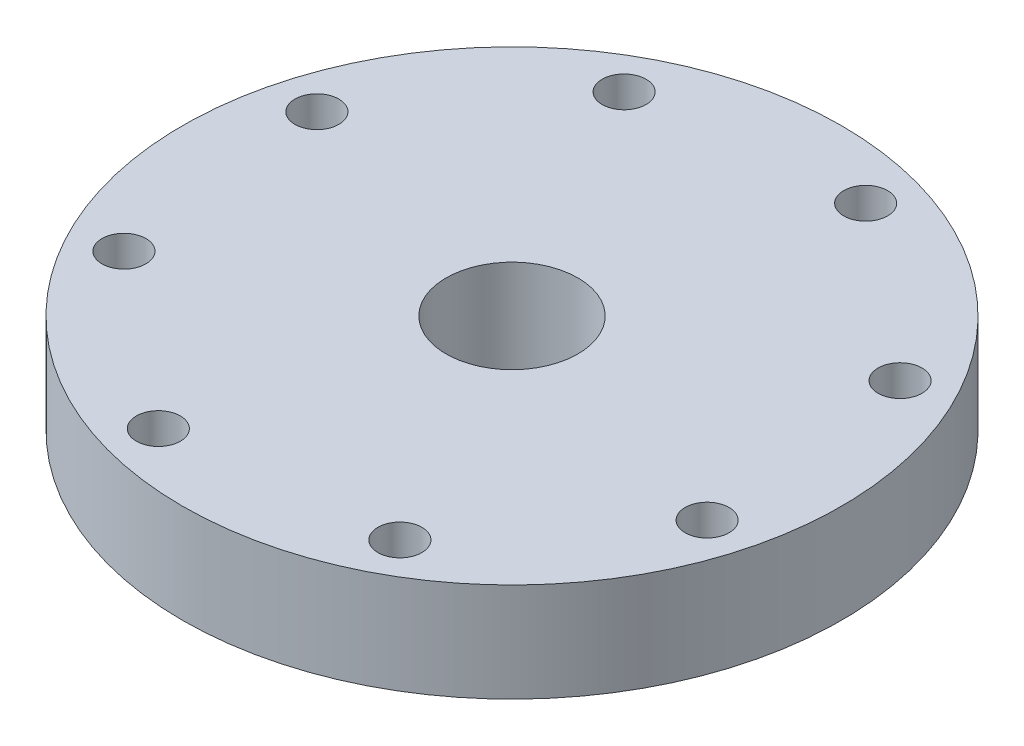
ISO-10303-21;
HEADER;
FILE_DESCRIPTION(('STEP AP214'),'2;1');
FILE_NAME('part.step','',(''),(''),'','','');
FILE_SCHEMA(('AUTOMOTIVE_DESIGN { 1 0 10303 214 1 1 1 1 }'));
ENDSEC;
DATA;
#1=APPLICATION_CONTEXT('core data for automotive mechanical design processes');
#2=APPLICATION_PROTOCOL_DEFINITION('international standard','automotive_design',2000,#1);
#3=PRODUCT_CONTEXT('',#1,'mechanical');
#4=PRODUCT('Part','Part','',(#3));
#5=PRODUCT_RELATED_PRODUCT_CATEGORY('part','',(#4));
#6=PRODUCT_DEFINITION_FORMATION('','',#4);
#7=PRODUCT_DEFINITION_CONTEXT('part definition',#1,'design');
#8=PRODUCT_DEFINITION('design','',#6,#7);
#9=PRODUCT_DEFINITION_SHAPE('','',#8);
#10=(LENGTH_UNIT() NAMED_UNIT(*) SI_UNIT(.MILLI.,.METRE.));
#11=(NAMED_UNIT(*) PLANE_ANGLE_UNIT() SI_UNIT($,.RADIAN.));
#12=(NAMED_UNIT(*) SI_UNIT($,.STERADIAN.) SOLID_ANGLE_UNIT());
#13=UNCERTAINTY_MEASURE_WITH_UNIT(LENGTH_MEASURE(1.E-05),#10,'distance_accuracy_value','');
#14=(GEOMETRIC_REPRESENTATION_CONTEXT(3) GLOBAL_UNCERTAINTY_ASSIGNED_CONTEXT((#13)) GLOBAL_UNIT_ASSIGNED_CONTEXT((#10,
#11,#12)) REPRESENTATION_CONTEXT('',''));
#15=CARTESIAN_POINT('',(0.,0.,0.));
#16=DIRECTION('',(0.,0.,1.));
#17=DIRECTION('',(1.,0.,0.));
#18=AXIS2_PLACEMENT_3D('',#15,#16,#17);
#19=CARTESIAN_POINT('',(0.,2.25,0.));
#20=DIRECTION('',(0.,-1.,0.));
#21=DIRECTION('',(0.,0.,-1.));
#22=AXIS2_PLACEMENT_3D('',#19,#20,#21);
#23=CYLINDRICAL_SURFACE('',#22,15.);
#24=CARTESIAN_POINT('',(0.,2.25,0.));
#25=DIRECTION('',(0.,1.,0.));
#26=DIRECTION('',(0.,0.,1.));
#27=AXIS2_PLACEMENT_3D('',#24,#25,#26);
#28=CIRCLE('',#27,15.);
#29=CARTESIAN_POINT('',(0.,2.25,15.));
#30=VERTEX_POINT('',#29);
#31=EDGE_CURVE('E10',#30,#30,#28,.T.);
#32=ORIENTED_EDGE('',*,*,#31,.F.);
#33=EDGE_LOOP('',(#32));
#34=FACE_BOUND('',#33,.T.);
#35=CARTESIAN_POINT('',(0.,-2.25,0.));
#36=DIRECTION('',(0.,1.,0.));
#37=DIRECTION('',(0.,0.,1.));
#38=AXIS2_PLACEMENT_3D('',#35,#36,#37);
#39=CIRCLE('',#38,15.);
#40=CARTESIAN_POINT('',(0.,-2.25,15.));
#41=VERTEX_POINT('',#40);
#42=EDGE_CURVE('E45',#41,#41,#39,.T.);
#43=ORIENTED_EDGE('',*,*,#42,.T.);
#44=EDGE_LOOP('',(#43));
#45=FACE_BOUND('',#44,.T.);
#46=ADVANCED_FACE('F37',(#34,#45),#23,.T.);
#47=CARTESIAN_POINT('',(0.,2.25,0.));
#48=DIRECTION('',(0.,1.,0.));
#49=DIRECTION('',(0.,0.,1.));
#50=AXIS2_PLACEMENT_3D('',#47,#48,#49);
#51=PLANE('',#50);
#52=CARTESIAN_POINT('',(0.,2.25,0.));
#53=DIRECTION('',(0.,-1.,0.));
#54=DIRECTION('',(0.,0.,-1.));
#55=AXIS2_PLACEMENT_3D('',#52,#53,#54);
#56=CIRCLE('',#55,3.);
#57=CARTESIAN_POINT('',(0.,2.25,-3.));
#58=VERTEX_POINT('',#57);
#59=EDGE_CURVE('E131',#58,#58,#56,.T.);
#60=ORIENTED_EDGE('',*,*,#59,.T.);
#61=EDGE_LOOP('',(#60));
#62=FACE_BOUND('',#61,.T.);
#63=CARTESIAN_POINT('',(-3.60811723817874,2.25,12.4892549816055));
#64=DIRECTION('',(0.,1.,0.));
#65=DIRECTION('',(0.,0.,1.));
#66=AXIS2_PLACEMENT_3D('',#63,#64,#65);
#67=CIRCLE('',#66,1.);
#68=CARTESIAN_POINT('',(-3.60811723817874,2.25,13.4892549816055));
#69=VERTEX_POINT('',#68);
#70=EDGE_CURVE('E135',#69,#69,#67,.T.);
#71=ORIENTED_EDGE('',*,*,#70,.F.);
#72=EDGE_LOOP('',(#71));
#73=FACE_BOUND('',#72,.T.);
#74=CARTESIAN_POINT('',(6.27991272302886,2.25,11.3825610558934));
#75=DIRECTION('',(0.,1.,0.));
#76=DIRECTION('',(0.,0.,1.));
#77=AXIS2_PLACEMENT_3D('',#74,#75,#76);
#78=CIRCLE('',#77,1.);
#79=CARTESIAN_POINT('',(6.27991272302886,2.25,12.3825610558934));
#80=VERTEX_POINT('',#79);
#81=EDGE_CURVE('E158',#80,#80,#78,.T.);
#82=ORIENTED_EDGE('',*,*,#81,.F.);
#83=EDGE_LOOP('',(#82));
#84=FACE_BOUND('',#83,.T.);
#85=CARTESIAN_POINT('',(12.4892549816055,2.25,3.6081172381787));
#86=DIRECTION('',(0.,1.,0.));
#87=DIRECTION('',(0.,0.,1.));
#88=AXIS2_PLACEMENT_3D('',#85,#86,#87);
#89=CIRCLE('',#88,1.);
#90=CARTESIAN_POINT('',(12.4892549816055,2.25,4.6081172381787));
#91=VERTEX_POINT('',#90);
#92=EDGE_CURVE('E154',#91,#91,#89,.T.);
#93=ORIENTED_EDGE('',*,*,#92,.F.);
#94=EDGE_LOOP('',(#93));
#95=FACE_BOUND('',#94,.T.);
#96=CARTESIAN_POINT('',(11.3825610558933,2.25,-6.2799127230289));
#97=DIRECTION('',(0.,1.,0.));
#98=DIRECTION('',(0.,0.,1.));
#99=AXIS2_PLACEMENT_3D('',#96,#97,#98);
#100=CIRCLE('',#99,1.);
#101=CARTESIAN_POINT('',(11.3825610558933,2.25,-5.2799127230289));
#102=VERTEX_POINT('',#101);
#103=EDGE_CURVE('E150',#102,#102,#100,.T.);
#104=ORIENTED_EDGE('',*,*,#103,.F.);
#105=EDGE_LOOP('',(#104));
#106=FACE_BOUND('',#105,.T.);
#107=CARTESIAN_POINT('',(3.60811723817866,2.25,-12.4892549816055));
#108=DIRECTION('',(0.,1.,0.));
#109=DIRECTION('',(0.,0.,1.));
#110=AXIS2_PLACEMENT_3D('',#107,#108,#109);
#111=CIRCLE('',#110,1.);
#112=CARTESIAN_POINT('',(3.60811723817866,2.25,-11.4892549816055));
#113=VERTEX_POINT('',#112);
#114=EDGE_CURVE('E146',#113,#113,#111,.T.);
#115=ORIENTED_EDGE('',*,*,#114,.F.);
#116=EDGE_LOOP('',(#115));
#117=FACE_BOUND('',#116,.T.);
#118=CARTESIAN_POINT('',(-6.27991272302894,2.25,-11.3825610558933));
#119=DIRECTION('',(0.,1.,0.));
#120=DIRECTION('',(0.,0.,1.));
#121=AXIS2_PLACEMENT_3D('',#118,#119,#120);
#122=CIRCLE('',#121,1.);
#123=CARTESIAN_POINT('',(-6.27991272302894,2.25,-10.3825610558933));
#124=VERTEX_POINT('',#123);
#125=EDGE_CURVE('E142',#124,#124,#122,.T.);
#126=ORIENTED_EDGE('',*,*,#125,.F.);
#127=EDGE_LOOP('',(#126));
#128=FACE_BOUND('',#127,.T.);
#129=CARTESIAN_POINT('',(-12.4892549816055,2.25,-3.60811723817861));
#130=DIRECTION('',(0.,1.,0.));
#131=DIRECTION('',(0.,0.,1.));
#132=AXIS2_PLACEMENT_3D('',#129,#130,#131);
#133=CIRCLE('',#132,0.999999999999999);
#134=CARTESIAN_POINT('',(-12.4892549816055,2.25,-2.60811723817861));
#135=VERTEX_POINT('',#134);
#136=EDGE_CURVE('E138',#135,#135,#133,.T.);
#137=ORIENTED_EDGE('',*,*,#136,.F.);
#138=EDGE_LOOP('',(#137));
#139=FACE_BOUND('',#138,.T.);
#140=CARTESIAN_POINT('',(-11.3825610558933,2.25,6.27991272302898));
#141=DIRECTION('',(0.,1.,0.));
#142=DIRECTION('',(0.,0.,1.));
#143=AXIS2_PLACEMENT_3D('',#140,#141,#142);
#144=CIRCLE('',#143,1.);
#145=CARTESIAN_POINT('',(-11.3825610558933,2.25,7.27991272302898));
#146=VERTEX_POINT('',#145);
#147=EDGE_CURVE('E53',#146,#146,#144,.T.);
#148=ORIENTED_EDGE('',*,*,#147,.F.);
#149=EDGE_LOOP('',(#148));
#150=FACE_BOUND('',#149,.T.);
#151=ORIENTED_EDGE('',*,*,#31,.T.);
#152=EDGE_LOOP('',(#151));
#153=FACE_BOUND('',#152,.T.);
#154=ADVANCED_FACE('F108',(#62,#73,#84,#95,#106,#117,#128,#139,#150,#153),#51,.T.);
#155=CARTESIAN_POINT('',(0.,-2.25,0.));
#156=DIRECTION('',(0.,1.,0.));
#157=DIRECTION('',(0.,0.,1.));
#158=AXIS2_PLACEMENT_3D('',#155,#156,#157);
#159=PLANE('',#158);
#160=CARTESIAN_POINT('',(0.,-2.25,0.));
#161=DIRECTION('',(0.,-1.,0.));
#162=DIRECTION('',(0.,0.,-1.));
#163=AXIS2_PLACEMENT_3D('',#160,#161,#162);
#164=CIRCLE('',#163,3.);
#165=CARTESIAN_POINT('',(0.,-2.25,-3.));
#166=VERTEX_POINT('',#165);
#167=EDGE_CURVE('E128',#166,#166,#164,.T.);
#168=ORIENTED_EDGE('',*,*,#167,.F.);
#169=EDGE_LOOP('',(#168));
#170=FACE_BOUND('',#169,.T.);
#171=CARTESIAN_POINT('',(-3.60811723817874,-2.25,12.4892549816055));
#172=DIRECTION('',(0.,1.,0.));
#173=DIRECTION('',(0.,0.,1.));
#174=AXIS2_PLACEMENT_3D('',#171,#172,#173);
#175=CIRCLE('',#174,1.);
#176=CARTESIAN_POINT('',(-3.60811723817874,-2.25,13.4892549816055));
#177=VERTEX_POINT('',#176);
#178=EDGE_CURVE('E40',#177,#177,#175,.T.);
#179=ORIENTED_EDGE('',*,*,#178,.T.);
#180=EDGE_LOOP('',(#179));
#181=FACE_BOUND('',#180,.T.);
#182=CARTESIAN_POINT('',(6.27991272302886,-2.25,11.3825610558934));
#183=DIRECTION('',(0.,1.,0.));
#184=DIRECTION('',(0.,0.,1.));
#185=AXIS2_PLACEMENT_3D('',#182,#183,#184);
#186=CIRCLE('',#185,1.);
#187=CARTESIAN_POINT('',(6.27991272302886,-2.25,12.3825610558934));
#188=VERTEX_POINT('',#187);
#189=EDGE_CURVE('E79',#188,#188,#186,.T.);
#190=ORIENTED_EDGE('',*,*,#189,.T.);
#191=EDGE_LOOP('',(#190));
#192=FACE_BOUND('',#191,.T.);
#193=CARTESIAN_POINT('',(12.4892549816055,-2.25,3.6081172381787));
#194=DIRECTION('',(0.,1.,0.));
#195=DIRECTION('',(0.,0.,1.));
#196=AXIS2_PLACEMENT_3D('',#193,#194,#195);
#197=CIRCLE('',#196,1.);
#198=CARTESIAN_POINT('',(12.4892549816055,-2.25,4.6081172381787));
#199=VERTEX_POINT('',#198);
#200=EDGE_CURVE('E76',#199,#199,#197,.T.);
#201=ORIENTED_EDGE('',*,*,#200,.T.);
#202=EDGE_LOOP('',(#201));
#203=FACE_BOUND('',#202,.T.);
#204=CARTESIAN_POINT('',(11.3825610558933,-2.25,-6.2799127230289));
#205=DIRECTION('',(0.,1.,0.));
#206=DIRECTION('',(0.,0.,1.));
#207=AXIS2_PLACEMENT_3D('',#204,#205,#206);
#208=CIRCLE('',#207,1.);
#209=CARTESIAN_POINT('',(11.3825610558933,-2.25,-5.2799127230289));
#210=VERTEX_POINT('',#209);
#211=EDGE_CURVE('E72',#210,#210,#208,.T.);
#212=ORIENTED_EDGE('',*,*,#211,.T.);
#213=EDGE_LOOP('',(#212));
#214=FACE_BOUND('',#213,.T.);
#215=CARTESIAN_POINT('',(3.60811723817866,-2.25,-12.4892549816055));
#216=DIRECTION('',(0.,1.,0.));
#217=DIRECTION('',(0.,0.,1.));
#218=AXIS2_PLACEMENT_3D('',#215,#216,#217);
#219=CIRCLE('',#218,1.);
#220=CARTESIAN_POINT('',(3.60811723817866,-2.25,-11.4892549816055));
#221=VERTEX_POINT('',#220);
#222=EDGE_CURVE('E68',#221,#221,#219,.T.);
#223=ORIENTED_EDGE('',*,*,#222,.T.);
#224=EDGE_LOOP('',(#223));
#225=FACE_BOUND('',#224,.T.);
#226=CARTESIAN_POINT('',(-6.27991272302894,-2.25,-11.3825610558933));
#227=DIRECTION('',(0.,1.,0.));
#228=DIRECTION('',(0.,0.,1.));
#229=AXIS2_PLACEMENT_3D('',#226,#227,#228);
#230=CIRCLE('',#229,1.);
#231=CARTESIAN_POINT('',(-6.27991272302894,-2.25,-10.3825610558933));
#232=VERTEX_POINT('',#231);
#233=EDGE_CURVE('E64',#232,#232,#230,.T.);
#234=ORIENTED_EDGE('',*,*,#233,.T.);
#235=EDGE_LOOP('',(#234));
#236=FACE_BOUND('',#235,.T.);
#237=CARTESIAN_POINT('',(-12.4892549816055,-2.25,-3.60811723817861));
#238=DIRECTION('',(0.,1.,0.));
#239=DIRECTION('',(0.,0.,1.));
#240=AXIS2_PLACEMENT_3D('',#237,#238,#239);
#241=CIRCLE('',#240,0.999999999999999);
#242=CARTESIAN_POINT('',(-12.4892549816055,-2.25,-2.60811723817861));
#243=VERTEX_POINT('',#242);
#244=EDGE_CURVE('E60',#243,#243,#241,.T.);
#245=ORIENTED_EDGE('',*,*,#244,.T.);
#246=EDGE_LOOP('',(#245));
#247=FACE_BOUND('',#246,.T.);
#248=CARTESIAN_POINT('',(-11.3825610558933,-2.25,6.27991272302898));
#249=DIRECTION('',(0.,1.,0.));
#250=DIRECTION('',(0.,0.,1.));
#251=AXIS2_PLACEMENT_3D('',#248,#249,#250);
#252=CIRCLE('',#251,1.);
#253=CARTESIAN_POINT('',(-11.3825610558933,-2.25,7.27991272302898));
#254=VERTEX_POINT('',#253);
#255=EDGE_CURVE('E56',#254,#254,#252,.T.);
#256=ORIENTED_EDGE('',*,*,#255,.T.);
#257=EDGE_LOOP('',(#256));
#258=FACE_BOUND('',#257,.T.);
#259=ORIENTED_EDGE('',*,*,#42,.F.);
#260=EDGE_LOOP('',(#259));
#261=FACE_BOUND('',#260,.T.);
#262=ADVANCED_FACE('F88',(#170,#181,#192,#203,#214,#225,#236,#247,#258,#261),#159,.F.);
#263=CARTESIAN_POINT('',(-11.3825610558933,-2.75,6.27991272302898));
#264=DIRECTION('',(0.,1.,0.));
#265=DIRECTION('',(0.,0.,1.));
#266=AXIS2_PLACEMENT_3D('',#263,#264,#265);
#267=CYLINDRICAL_SURFACE('',#266,1.);
#268=ORIENTED_EDGE('',*,*,#147,.T.);
#269=EDGE_LOOP('',(#268));
#270=FACE_BOUND('',#269,.T.);
#271=ORIENTED_EDGE('',*,*,#255,.F.);
#272=EDGE_LOOP('',(#271));
#273=FACE_BOUND('',#272,.T.);
#274=ADVANCED_FACE('F119',(#270,#273),#267,.F.);
#275=CARTESIAN_POINT('',(-12.4892549816055,-2.75,-3.60811723817861));
#276=DIRECTION('',(0.,1.,0.));
#277=DIRECTION('',(0.,0.,1.));
#278=AXIS2_PLACEMENT_3D('',#275,#276,#277);
#279=CYLINDRICAL_SURFACE('',#278,0.999999999999999);
#280=ORIENTED_EDGE('',*,*,#136,.T.);
#281=EDGE_LOOP('',(#280));
#282=FACE_BOUND('',#281,.T.);
#283=ORIENTED_EDGE('',*,*,#244,.F.);
#284=EDGE_LOOP('',(#283));
#285=FACE_BOUND('',#284,.T.);
#286=ADVANCED_FACE('F124',(#282,#285),#279,.F.);
#287=CARTESIAN_POINT('',(-6.27991272302894,-2.75,-11.3825610558933));
#288=DIRECTION('',(0.,1.,0.));
#289=DIRECTION('',(0.,0.,1.));
#290=AXIS2_PLACEMENT_3D('',#287,#288,#289);
#291=CYLINDRICAL_SURFACE('',#290,1.);
#292=ORIENTED_EDGE('',*,*,#125,.T.);
#293=EDGE_LOOP('',(#292));
#294=FACE_BOUND('',#293,.T.);
#295=ORIENTED_EDGE('',*,*,#233,.F.);
#296=EDGE_LOOP('',(#295));
#297=FACE_BOUND('',#296,.T.);
#298=ADVANCED_FACE('F186',(#294,#297),#291,.F.);
#299=CARTESIAN_POINT('',(3.60811723817866,-2.75,-12.4892549816055));
#300=DIRECTION('',(0.,1.,0.));
#301=DIRECTION('',(0.,0.,1.));
#302=AXIS2_PLACEMENT_3D('',#299,#300,#301);
#303=CYLINDRICAL_SURFACE('',#302,1.);
#304=ORIENTED_EDGE('',*,*,#114,.T.);
#305=EDGE_LOOP('',(#304));
#306=FACE_BOUND('',#305,.T.);
#307=ORIENTED_EDGE('',*,*,#222,.F.);
#308=EDGE_LOOP('',(#307));
#309=FACE_BOUND('',#308,.T.);
#310=ADVANCED_FACE('F193',(#306,#309),#303,.F.);
#311=CARTESIAN_POINT('',(11.3825610558933,-2.75,-6.2799127230289));
#312=DIRECTION('',(0.,1.,0.));
#313=DIRECTION('',(0.,0.,1.));
#314=AXIS2_PLACEMENT_3D('',#311,#312,#313);
#315=CYLINDRICAL_SURFACE('',#314,1.);
#316=ORIENTED_EDGE('',*,*,#103,.T.);
#317=EDGE_LOOP('',(#316));
#318=FACE_BOUND('',#317,.T.);
#319=ORIENTED_EDGE('',*,*,#211,.F.);
#320=EDGE_LOOP('',(#319));
#321=FACE_BOUND('',#320,.T.);
#322=ADVANCED_FACE('F199',(#318,#321),#315,.F.);
#323=CARTESIAN_POINT('',(12.4892549816055,-2.75,3.6081172381787));
#324=DIRECTION('',(0.,1.,0.));
#325=DIRECTION('',(0.,0.,1.));
#326=AXIS2_PLACEMENT_3D('',#323,#324,#325);
#327=CYLINDRICAL_SURFACE('',#326,1.);
#328=ORIENTED_EDGE('',*,*,#92,.T.);
#329=EDGE_LOOP('',(#328));
#330=FACE_BOUND('',#329,.T.);
#331=ORIENTED_EDGE('',*,*,#200,.F.);
#332=EDGE_LOOP('',(#331));
#333=FACE_BOUND('',#332,.T.);
#334=ADVANCED_FACE('F102',(#330,#333),#327,.F.);
#335=CARTESIAN_POINT('',(6.27991272302886,-2.75,11.3825610558934));
#336=DIRECTION('',(0.,1.,0.));
#337=DIRECTION('',(0.,0.,1.));
#338=AXIS2_PLACEMENT_3D('',#335,#336,#337);
#339=CYLINDRICAL_SURFACE('',#338,1.);
#340=ORIENTED_EDGE('',*,*,#81,.T.);
#341=EDGE_LOOP('',(#340));
#342=FACE_BOUND('',#341,.T.);
#343=ORIENTED_EDGE('',*,*,#189,.F.);
#344=EDGE_LOOP('',(#343));
#345=FACE_BOUND('',#344,.T.);
#346=ADVANCED_FACE('F93',(#342,#345),#339,.F.);
#347=CARTESIAN_POINT('',(-3.60811723817874,-2.75,12.4892549816055));
#348=DIRECTION('',(0.,1.,0.));
#349=DIRECTION('',(0.,0.,1.));
#350=AXIS2_PLACEMENT_3D('',#347,#348,#349);
#351=CYLINDRICAL_SURFACE('',#350,1.);
#352=ORIENTED_EDGE('',*,*,#70,.T.);
#353=EDGE_LOOP('',(#352));
#354=FACE_BOUND('',#353,.T.);
#355=ORIENTED_EDGE('',*,*,#178,.F.);
#356=EDGE_LOOP('',(#355));
#357=FACE_BOUND('',#356,.T.);
#358=ADVANCED_FACE('F90',(#354,#357),#351,.F.);
#359=CARTESIAN_POINT('',(0.,2.25,0.));
#360=DIRECTION('',(0.,-1.,0.));
#361=DIRECTION('',(0.,0.,-1.));
#362=AXIS2_PLACEMENT_3D('',#359,#360,#361);
#363=CYLINDRICAL_SURFACE('',#362,3.);
#364=ORIENTED_EDGE('',*,*,#59,.F.);
#365=EDGE_LOOP('',(#364));
#366=FACE_BOUND('',#365,.T.);
#367=ORIENTED_EDGE('',*,*,#167,.T.);
#368=EDGE_LOOP('',(#367));
#369=FACE_BOUND('',#368,.T.);
#370=ADVANCED_FACE('F92',(#366,#369),#363,.F.);
#371=CLOSED_SHELL('',(#46,#154,#262,#274,#286,#298,#310,#322,#334,#346,#358,#370));
#372=MANIFOLD_SOLID_BREP('B2',#371);
#373=ADVANCED_BREP_SHAPE_REPRESENTATION('',(#18,#372),#14);
#374=SHAPE_DEFINITION_REPRESENTATION(#9,#373);
ENDSEC;
END-ISO-10303-21;
